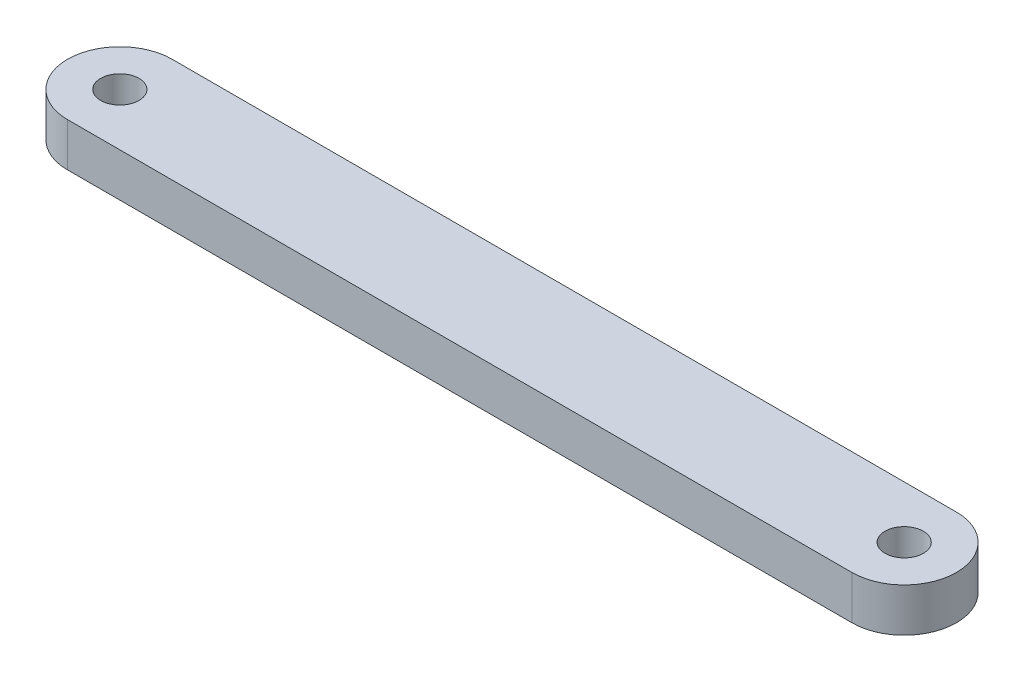
ISO-10303-21;
HEADER;
FILE_DESCRIPTION(('STEP AP214'),'2;1');
FILE_NAME('part.step','',(''),(''),'','','');
FILE_SCHEMA(('AUTOMOTIVE_DESIGN { 1 0 10303 214 1 1 1 1 }'));
ENDSEC;
DATA;
#1=APPLICATION_CONTEXT('core data for automotive mechanical design processes');
#2=APPLICATION_PROTOCOL_DEFINITION('international standard','automotive_design',2000,#1);
#3=PRODUCT_CONTEXT('',#1,'mechanical');
#4=PRODUCT('Part','Part','',(#3));
#5=PRODUCT_RELATED_PRODUCT_CATEGORY('part','',(#4));
#6=PRODUCT_DEFINITION_FORMATION('','',#4);
#7=PRODUCT_DEFINITION_CONTEXT('part definition',#1,'design');
#8=PRODUCT_DEFINITION('design','',#6,#7);
#9=PRODUCT_DEFINITION_SHAPE('','',#8);
#10=(LENGTH_UNIT() NAMED_UNIT(*) SI_UNIT(.MILLI.,.METRE.));
#11=(NAMED_UNIT(*) PLANE_ANGLE_UNIT() SI_UNIT($,.RADIAN.));
#12=(NAMED_UNIT(*) SI_UNIT($,.STERADIAN.) SOLID_ANGLE_UNIT());
#13=UNCERTAINTY_MEASURE_WITH_UNIT(LENGTH_MEASURE(1.E-05),#10,'distance_accuracy_value','');
#14=(GEOMETRIC_REPRESENTATION_CONTEXT(3) GLOBAL_UNCERTAINTY_ASSIGNED_CONTEXT((#13)) GLOBAL_UNIT_ASSIGNED_CONTEXT((#10,
#11,#12)) REPRESENTATION_CONTEXT('',''));
#15=CARTESIAN_POINT('',(0.,0.,0.));
#16=DIRECTION('',(0.,0.,1.));
#17=DIRECTION('',(1.,0.,0.));
#18=AXIS2_PLACEMENT_3D('',#15,#16,#17);
#19=CARTESIAN_POINT('',(0.,2.5,3.00000000000003));
#20=DIRECTION('',(0.,0.,1.));
#21=DIRECTION('',(1.,0.,0.));
#22=AXIS2_PLACEMENT_3D('',#19,#20,#21);
#23=PLANE('',#22);
#24=DIRECTION('',(-1.,0.,0.));
#25=VECTOR('',#24,1.);
#26=CARTESIAN_POINT('',(0.,0.,3.00000000000003));
#27=LINE('',#26,#25);
#28=CARTESIAN_POINT('',(22.5,0.,3.));
#29=VERTEX_POINT('',#28);
#30=CARTESIAN_POINT('',(-22.5,0.,3.00000000000006));
#31=VERTEX_POINT('',#30);
#32=EDGE_CURVE('E103',#29,#31,#27,.T.);
#33=ORIENTED_EDGE('',*,*,#32,.F.);
#34=DIRECTION('',(0.,-1.,0.));
#35=VECTOR('',#34,1.);
#36=CARTESIAN_POINT('',(22.5,2.5,3.));
#37=LINE('',#36,#35);
#38=CARTESIAN_POINT('',(22.5,2.5,3.));
#39=VERTEX_POINT('',#38);
#40=EDGE_CURVE('E11',#39,#29,#37,.T.);
#41=ORIENTED_EDGE('',*,*,#40,.F.);
#42=DIRECTION('',(-1.,0.,0.));
#43=VECTOR('',#42,1.);
#44=CARTESIAN_POINT('',(0.,2.5,3.00000000000003));
#45=LINE('',#44,#43);
#46=CARTESIAN_POINT('',(-22.5,2.5,3.00000000000006));
#47=VERTEX_POINT('',#46);
#48=EDGE_CURVE('E82',#39,#47,#45,.T.);
#49=ORIENTED_EDGE('',*,*,#48,.T.);
#50=DIRECTION('',(0.,-1.,0.));
#51=VECTOR('',#50,1.);
#52=CARTESIAN_POINT('',(-22.5,2.5,3.00000000000006));
#53=LINE('',#52,#51);
#54=EDGE_CURVE('E49',#47,#31,#53,.T.);
#55=ORIENTED_EDGE('',*,*,#54,.T.);
#56=EDGE_LOOP('',(#33,#41,#49,#55));
#57=FACE_BOUND('',#56,.T.);
#58=ADVANCED_FACE('F33',(#57),#23,.T.);
#59=CARTESIAN_POINT('',(22.5,2.5,0.));
#60=DIRECTION('',(0.,-1.,0.));
#61=DIRECTION('',(0.,0.,-1.));
#62=AXIS2_PLACEMENT_3D('',#59,#60,#61);
#63=CYLINDRICAL_SURFACE('',#62,3.);
#64=CARTESIAN_POINT('',(22.5,0.,0.));
#65=DIRECTION('',(0.,1.,0.));
#66=DIRECTION('',(0.,0.,1.));
#67=AXIS2_PLACEMENT_3D('',#64,#65,#66);
#68=CIRCLE('',#67,3.);
#69=CARTESIAN_POINT('',(22.5,0.,-3.));
#70=VERTEX_POINT('',#69);
#71=EDGE_CURVE('E88',#29,#70,#68,.T.);
#72=ORIENTED_EDGE('',*,*,#71,.T.);
#73=DIRECTION('',(0.,-1.,0.));
#74=VECTOR('',#73,1.);
#75=CARTESIAN_POINT('',(22.5,2.5,-3.));
#76=LINE('',#75,#74);
#77=CARTESIAN_POINT('',(22.5,2.5,-3.));
#78=VERTEX_POINT('',#77);
#79=EDGE_CURVE('E41',#78,#70,#76,.T.);
#80=ORIENTED_EDGE('',*,*,#79,.F.);
#81=CARTESIAN_POINT('',(22.5,2.5,0.));
#82=DIRECTION('',(0.,1.,0.));
#83=DIRECTION('',(0.,0.,1.));
#84=AXIS2_PLACEMENT_3D('',#81,#82,#83);
#85=CIRCLE('',#84,3.);
#86=EDGE_CURVE('E75',#39,#78,#85,.T.);
#87=ORIENTED_EDGE('',*,*,#86,.F.);
#88=ORIENTED_EDGE('',*,*,#40,.T.);
#89=EDGE_LOOP('',(#72,#80,#87,#88));
#90=FACE_BOUND('',#89,.T.);
#91=ADVANCED_FACE('F86',(#90),#63,.T.);
#92=CARTESIAN_POINT('',(0.,2.5,-3.));
#93=DIRECTION('',(0.,0.,-1.));
#94=DIRECTION('',(-1.,0.,0.));
#95=AXIS2_PLACEMENT_3D('',#92,#93,#94);
#96=PLANE('',#95);
#97=DIRECTION('',(1.,0.,0.));
#98=VECTOR('',#97,1.);
#99=CARTESIAN_POINT('',(0.,0.,-3.));
#100=LINE('',#99,#98);
#101=CARTESIAN_POINT('',(-22.5,0.,-3.00000000000002));
#102=VERTEX_POINT('',#101);
#103=EDGE_CURVE('E106',#102,#70,#100,.T.);
#104=ORIENTED_EDGE('',*,*,#103,.F.);
#105=DIRECTION('',(0.,-1.,0.));
#106=VECTOR('',#105,1.);
#107=CARTESIAN_POINT('',(-22.5,2.5,-3.00000000000002));
#108=LINE('',#107,#106);
#109=CARTESIAN_POINT('',(-22.5,2.5,-3.00000000000002));
#110=VERTEX_POINT('',#109);
#111=EDGE_CURVE('E62',#110,#102,#108,.T.);
#112=ORIENTED_EDGE('',*,*,#111,.F.);
#113=DIRECTION('',(1.,0.,0.));
#114=VECTOR('',#113,1.);
#115=CARTESIAN_POINT('',(0.,2.5,-3.));
#116=LINE('',#115,#114);
#117=EDGE_CURVE('E81',#110,#78,#116,.T.);
#118=ORIENTED_EDGE('',*,*,#117,.T.);
#119=ORIENTED_EDGE('',*,*,#79,.T.);
#120=EDGE_LOOP('',(#104,#112,#118,#119));
#121=FACE_BOUND('',#120,.T.);
#122=ADVANCED_FACE('F91',(#121),#96,.T.);
#123=CARTESIAN_POINT('',(-22.5,2.5,0.));
#124=DIRECTION('',(0.,-1.,0.));
#125=DIRECTION('',(0.,0.,-1.));
#126=AXIS2_PLACEMENT_3D('',#123,#124,#125);
#127=CYLINDRICAL_SURFACE('',#126,1.10000000000004);
#128=CARTESIAN_POINT('',(-22.5,2.5,0.));
#129=DIRECTION('',(0.,1.,0.));
#130=DIRECTION('',(0.,0.,1.));
#131=AXIS2_PLACEMENT_3D('',#128,#129,#130);
#132=CIRCLE('',#131,1.10000000000004);
#133=CARTESIAN_POINT('',(-22.5,2.5,1.10000000000005));
#134=VERTEX_POINT('',#133);
#135=EDGE_CURVE('E94',#134,#134,#132,.F.);
#136=ORIENTED_EDGE('',*,*,#135,.F.);
#137=EDGE_LOOP('',(#136));
#138=FACE_BOUND('',#137,.T.);
#139=CARTESIAN_POINT('',(-22.5,0.,0.));
#140=DIRECTION('',(0.,1.,0.));
#141=DIRECTION('',(0.,0.,1.));
#142=AXIS2_PLACEMENT_3D('',#139,#140,#141);
#143=CIRCLE('',#142,1.10000000000004);
#144=CARTESIAN_POINT('',(-22.5,0.,1.10000000000005));
#145=VERTEX_POINT('',#144);
#146=EDGE_CURVE('E111',#145,#145,#143,.F.);
#147=ORIENTED_EDGE('',*,*,#146,.T.);
#148=EDGE_LOOP('',(#147));
#149=FACE_BOUND('',#148,.T.);
#150=ADVANCED_FACE('F123',(#138,#149),#127,.F.);
#151=CARTESIAN_POINT('',(-22.5,2.5,0.));
#152=DIRECTION('',(0.,-1.,0.));
#153=DIRECTION('',(0.,0.,-1.));
#154=AXIS2_PLACEMENT_3D('',#151,#152,#153);
#155=CYLINDRICAL_SURFACE('',#154,3.00000000000005);
#156=CARTESIAN_POINT('',(-22.5,0.,0.));
#157=DIRECTION('',(0.,1.,0.));
#158=DIRECTION('',(0.,0.,1.));
#159=AXIS2_PLACEMENT_3D('',#156,#157,#158);
#160=CIRCLE('',#159,3.00000000000005);
#161=EDGE_CURVE('E108',#31,#102,#160,.F.);
#162=ORIENTED_EDGE('',*,*,#161,.F.);
#163=ORIENTED_EDGE('',*,*,#54,.F.);
#164=CARTESIAN_POINT('',(-22.5,2.5,0.));
#165=DIRECTION('',(0.,1.,0.));
#166=DIRECTION('',(0.,0.,1.));
#167=AXIS2_PLACEMENT_3D('',#164,#165,#166);
#168=CIRCLE('',#167,3.00000000000005);
#169=EDGE_CURVE('E92',#47,#110,#168,.F.);
#170=ORIENTED_EDGE('',*,*,#169,.T.);
#171=ORIENTED_EDGE('',*,*,#111,.T.);
#172=EDGE_LOOP('',(#162,#163,#170,#171));
#173=FACE_BOUND('',#172,.T.);
#174=ADVANCED_FACE('F120',(#173),#155,.T.);
#175=CARTESIAN_POINT('',(22.5,2.5,0.));
#176=DIRECTION('',(0.,-1.,0.));
#177=DIRECTION('',(0.,0.,-1.));
#178=AXIS2_PLACEMENT_3D('',#175,#176,#177);
#179=CYLINDRICAL_SURFACE('',#178,1.1);
#180=CARTESIAN_POINT('',(22.5,2.5,0.));
#181=DIRECTION('',(0.,1.,0.));
#182=DIRECTION('',(0.,0.,1.));
#183=AXIS2_PLACEMENT_3D('',#180,#181,#182);
#184=CIRCLE('',#183,1.1);
#185=CARTESIAN_POINT('',(22.5,2.5,1.1));
#186=VERTEX_POINT('',#185);
#187=EDGE_CURVE('E100',#186,#186,#184,.T.);
#188=ORIENTED_EDGE('',*,*,#187,.T.);
#189=EDGE_LOOP('',(#188));
#190=FACE_BOUND('',#189,.T.);
#191=CARTESIAN_POINT('',(22.5,0.,0.));
#192=DIRECTION('',(0.,1.,0.));
#193=DIRECTION('',(0.,0.,1.));
#194=AXIS2_PLACEMENT_3D('',#191,#192,#193);
#195=CIRCLE('',#194,1.1);
#196=CARTESIAN_POINT('',(22.5,0.,1.1));
#197=VERTEX_POINT('',#196);
#198=EDGE_CURVE('E114',#197,#197,#195,.T.);
#199=ORIENTED_EDGE('',*,*,#198,.F.);
#200=EDGE_LOOP('',(#199));
#201=FACE_BOUND('',#200,.T.);
#202=ADVANCED_FACE('F122',(#190,#201),#179,.F.);
#203=CARTESIAN_POINT('',(0.,2.5,0.));
#204=DIRECTION('',(0.,1.,0.));
#205=DIRECTION('',(0.,0.,1.));
#206=AXIS2_PLACEMENT_3D('',#203,#204,#205);
#207=PLANE('',#206);
#208=ORIENTED_EDGE('',*,*,#48,.F.);
#209=ORIENTED_EDGE('',*,*,#86,.T.);
#210=ORIENTED_EDGE('',*,*,#117,.F.);
#211=ORIENTED_EDGE('',*,*,#169,.F.);
#212=EDGE_LOOP('',(#208,#209,#210,#211));
#213=FACE_BOUND('',#212,.T.);
#214=ORIENTED_EDGE('',*,*,#135,.T.);
#215=EDGE_LOOP('',(#214));
#216=FACE_BOUND('',#215,.T.);
#217=ORIENTED_EDGE('',*,*,#187,.F.);
#218=EDGE_LOOP('',(#217));
#219=FACE_BOUND('',#218,.T.);
#220=ADVANCED_FACE('F77',(#213,#216,#219),#207,.T.);
#221=CARTESIAN_POINT('',(0.,0.,0.));
#222=DIRECTION('',(0.,1.,0.));
#223=DIRECTION('',(0.,0.,1.));
#224=AXIS2_PLACEMENT_3D('',#221,#222,#223);
#225=PLANE('',#224);
#226=ORIENTED_EDGE('',*,*,#32,.T.);
#227=ORIENTED_EDGE('',*,*,#161,.T.);
#228=ORIENTED_EDGE('',*,*,#103,.T.);
#229=ORIENTED_EDGE('',*,*,#71,.F.);
#230=EDGE_LOOP('',(#226,#227,#228,#229));
#231=FACE_BOUND('',#230,.T.);
#232=ORIENTED_EDGE('',*,*,#146,.F.);
#233=EDGE_LOOP('',(#232));
#234=FACE_BOUND('',#233,.T.);
#235=ORIENTED_EDGE('',*,*,#198,.T.);
#236=EDGE_LOOP('',(#235));
#237=FACE_BOUND('',#236,.T.);
#238=ADVANCED_FACE('F167',(#231,#234,#237),#225,.F.);
#239=CLOSED_SHELL('',(#58,#91,#122,#150,#174,#202,#220,#238));
#240=MANIFOLD_SOLID_BREP('B2',#239);
#241=ADVANCED_BREP_SHAPE_REPRESENTATION('',(#18,#240),#14);
#242=SHAPE_DEFINITION_REPRESENTATION(#9,#241);
ENDSEC;
END-ISO-10303-21;
